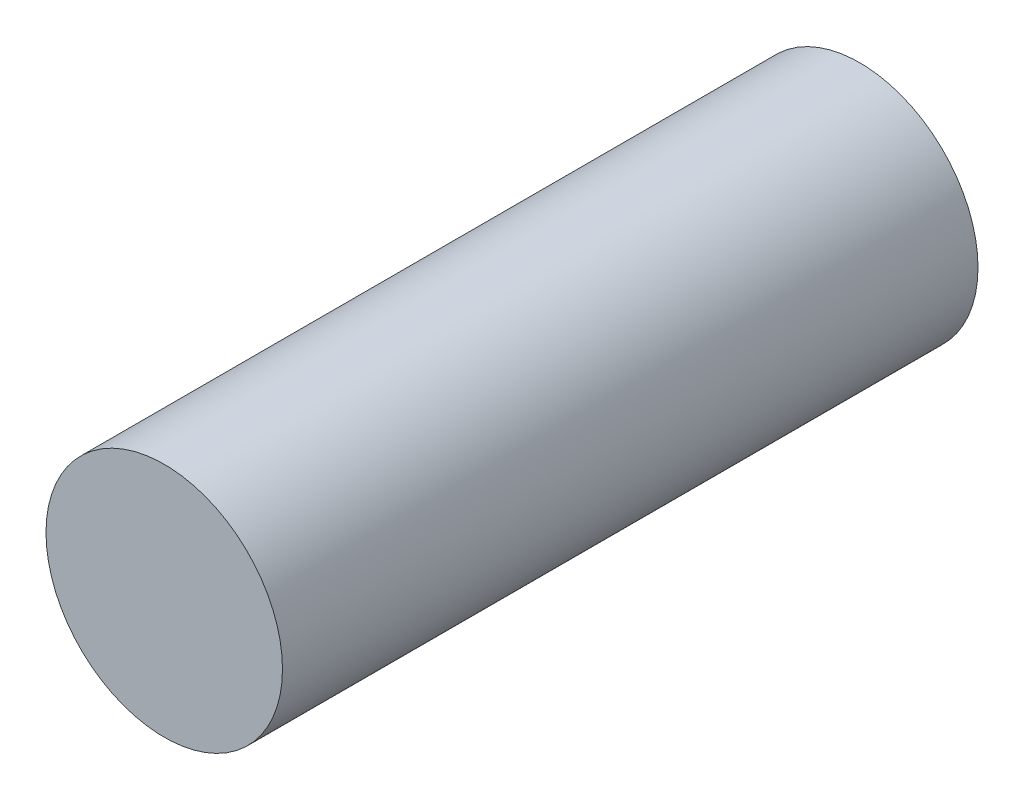
ISO-10303-21;
HEADER;
FILE_DESCRIPTION(('STEP AP214'),'2;1');
FILE_NAME('part.step','',(''),(''),'','','');
FILE_SCHEMA(('AUTOMOTIVE_DESIGN { 1 0 10303 214 1 1 1 1 }'));
ENDSEC;
DATA;
#1=APPLICATION_CONTEXT('core data for automotive mechanical design processes');
#2=APPLICATION_PROTOCOL_DEFINITION('international standard','automotive_design',2000,#1);
#3=PRODUCT_CONTEXT('',#1,'mechanical');
#4=PRODUCT('Part','Part','',(#3));
#5=PRODUCT_RELATED_PRODUCT_CATEGORY('part','',(#4));
#6=PRODUCT_DEFINITION_FORMATION('','',#4);
#7=PRODUCT_DEFINITION_CONTEXT('part definition',#1,'design');
#8=PRODUCT_DEFINITION('design','',#6,#7);
#9=PRODUCT_DEFINITION_SHAPE('','',#8);
#10=(LENGTH_UNIT() NAMED_UNIT(*) SI_UNIT(.MILLI.,.METRE.));
#11=(NAMED_UNIT(*) PLANE_ANGLE_UNIT() SI_UNIT($,.RADIAN.));
#12=(NAMED_UNIT(*) SI_UNIT($,.STERADIAN.) SOLID_ANGLE_UNIT());
#13=UNCERTAINTY_MEASURE_WITH_UNIT(LENGTH_MEASURE(1.E-05),#10,'distance_accuracy_value','');
#14=(GEOMETRIC_REPRESENTATION_CONTEXT(3) GLOBAL_UNCERTAINTY_ASSIGNED_CONTEXT((#13)) GLOBAL_UNIT_ASSIGNED_CONTEXT((#10,
#11,#12)) REPRESENTATION_CONTEXT('',''));
#15=CARTESIAN_POINT('',(0.,0.,0.));
#16=DIRECTION('',(0.,0.,1.));
#17=DIRECTION('',(1.,0.,0.));
#18=AXIS2_PLACEMENT_3D('',#15,#16,#17);
#19=CARTESIAN_POINT('',(0.,0.,25.));
#20=DIRECTION('',(0.,0.,-1.));
#21=DIRECTION('',(-1.,0.,0.));
#22=AXIS2_PLACEMENT_3D('',#19,#20,#21);
#23=CYLINDRICAL_SURFACE('',#22,4.25);
#24=CARTESIAN_POINT('',(0.,0.,25.));
#25=DIRECTION('',(0.,0.,1.));
#26=DIRECTION('',(1.,0.,0.));
#27=AXIS2_PLACEMENT_3D('',#24,#25,#26);
#28=CIRCLE('',#27,4.25);
#29=CARTESIAN_POINT('',(4.25,0.,25.));
#30=VERTEX_POINT('',#29);
#31=EDGE_CURVE('E10',#30,#30,#28,.T.);
#32=ORIENTED_EDGE('',*,*,#31,.F.);
#33=EDGE_LOOP('',(#32));
#34=FACE_BOUND('',#33,.T.);
#35=CARTESIAN_POINT('',(0.,0.,0.));
#36=DIRECTION('',(0.,0.,1.));
#37=DIRECTION('',(1.,0.,0.));
#38=AXIS2_PLACEMENT_3D('',#35,#36,#37);
#39=CIRCLE('',#38,4.25);
#40=CARTESIAN_POINT('',(4.25,0.,0.));
#41=VERTEX_POINT('',#40);
#42=EDGE_CURVE('E43',#41,#41,#39,.T.);
#43=ORIENTED_EDGE('',*,*,#42,.T.);
#44=EDGE_LOOP('',(#43));
#45=FACE_BOUND('',#44,.T.);
#46=ADVANCED_FACE('F40',(#34,#45),#23,.T.);
#47=CARTESIAN_POINT('',(0.,0.,25.));
#48=DIRECTION('',(0.,0.,1.));
#49=DIRECTION('',(1.,0.,0.));
#50=AXIS2_PLACEMENT_3D('',#47,#48,#49);
#51=PLANE('',#50);
#52=ORIENTED_EDGE('',*,*,#31,.T.);
#53=EDGE_LOOP('',(#52));
#54=FACE_BOUND('',#53,.T.);
#55=ADVANCED_FACE('F55',(#54),#51,.T.);
#56=CARTESIAN_POINT('',(0.,0.,0.));
#57=DIRECTION('',(0.,0.,1.));
#58=DIRECTION('',(1.,0.,0.));
#59=AXIS2_PLACEMENT_3D('',#56,#57,#58);
#60=PLANE('',#59);
#61=ORIENTED_EDGE('',*,*,#42,.F.);
#62=EDGE_LOOP('',(#61));
#63=FACE_BOUND('',#62,.T.);
#64=ADVANCED_FACE('F53',(#63),#60,.F.);
#65=CLOSED_SHELL('',(#46,#55,#64));
#66=MANIFOLD_SOLID_BREP('B2',#65);
#67=ADVANCED_BREP_SHAPE_REPRESENTATION('',(#18,#66),#14);
#68=SHAPE_DEFINITION_REPRESENTATION(#9,#67);
ENDSEC;
END-ISO-10303-21;
